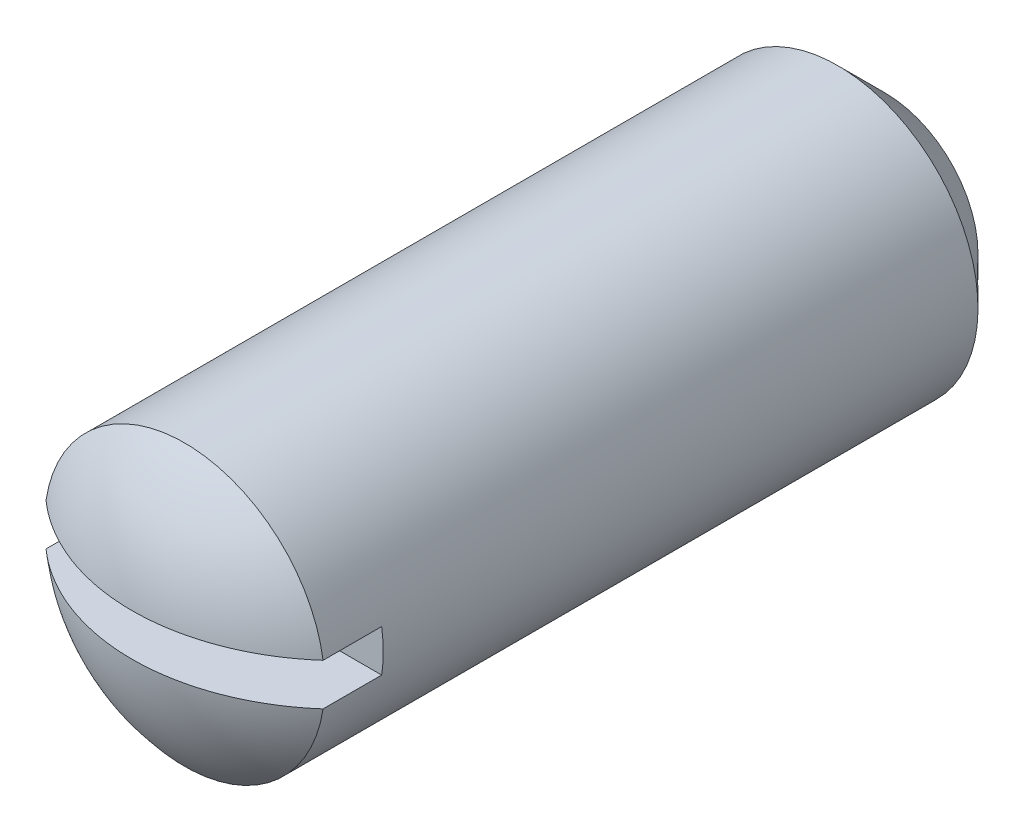
ISO-10303-21;
HEADER;
FILE_DESCRIPTION(('STEP AP214'),'2;1');
FILE_NAME('part.step','',(''),(''),'','','');
FILE_SCHEMA(('AUTOMOTIVE_DESIGN { 1 0 10303 214 1 1 1 1 }'));
ENDSEC;
DATA;
#1=APPLICATION_CONTEXT('core data for automotive mechanical design processes');
#2=APPLICATION_PROTOCOL_DEFINITION('international standard','automotive_design',2000,#1);
#3=PRODUCT_CONTEXT('',#1,'mechanical');
#4=PRODUCT('Part','Part','',(#3));
#5=PRODUCT_RELATED_PRODUCT_CATEGORY('part','',(#4));
#6=PRODUCT_DEFINITION_FORMATION('','',#4);
#7=PRODUCT_DEFINITION_CONTEXT('part definition',#1,'design');
#8=PRODUCT_DEFINITION('design','',#6,#7);
#9=PRODUCT_DEFINITION_SHAPE('','',#8);
#10=(LENGTH_UNIT() NAMED_UNIT(*) SI_UNIT(.MILLI.,.METRE.));
#11=(NAMED_UNIT(*) PLANE_ANGLE_UNIT() SI_UNIT($,.RADIAN.));
#12=(NAMED_UNIT(*) SI_UNIT($,.STERADIAN.) SOLID_ANGLE_UNIT());
#13=UNCERTAINTY_MEASURE_WITH_UNIT(LENGTH_MEASURE(1.E-05),#10,'distance_accuracy_value','');
#14=(GEOMETRIC_REPRESENTATION_CONTEXT(3) GLOBAL_UNCERTAINTY_ASSIGNED_CONTEXT((#13)) GLOBAL_UNIT_ASSIGNED_CONTEXT((#10,
#11,#12)) REPRESENTATION_CONTEXT('',''));
#15=CARTESIAN_POINT('',(0.,0.,0.));
#16=DIRECTION('',(0.,0.,1.));
#17=DIRECTION('',(1.,0.,0.));
#18=AXIS2_PLACEMENT_3D('',#15,#16,#17);
#19=CARTESIAN_POINT('',(0.,0.,-10.));
#20=DIRECTION('',(0.,0.,-1.));
#21=DIRECTION('',(0.,1.,0.));
#22=AXIS2_PLACEMENT_3D('',#19,#20,#21);
#23=CYLINDRICAL_SURFACE('',#22,4.);
#24=CARTESIAN_POINT('',(0.,0.,-8.65));
#25=DIRECTION('',(0.,0.,1.));
#26=DIRECTION('',(0.,-1.,0.));
#27=AXIS2_PLACEMENT_3D('',#24,#25,#26);
#28=CIRCLE('',#27,4.);
#29=CARTESIAN_POINT('',(0.,-4.,-8.65));
#30=VERTEX_POINT('',#29);
#31=EDGE_CURVE('E132',#30,#30,#28,.T.);
#32=ORIENTED_EDGE('',*,*,#31,.T.);
#33=EDGE_LOOP('',(#32));
#34=FACE_BOUND('',#33,.T.);
#35=DIRECTION('',(0.,0.,-1.));
#36=VECTOR('',#35,1.);
#37=CARTESIAN_POINT('',(3.95474398665704,-0.599999999999998,-10.));
#38=LINE('',#37,#36);
#39=CARTESIAN_POINT('',(3.95474398665704,-0.600000000000001,10.));
#40=VERTEX_POINT('',#39);
#41=CARTESIAN_POINT('',(3.95474398665704,-0.600000000000001,8.32786404500042));
#42=VERTEX_POINT('',#41);
#43=EDGE_CURVE('E143',#40,#42,#38,.T.);
#44=ORIENTED_EDGE('',*,*,#43,.F.);
#45=CARTESIAN_POINT('',(0.,0.,10.));
#46=DIRECTION('',(0.,0.,-1.));
#47=DIRECTION('',(0.,1.,0.));
#48=AXIS2_PLACEMENT_3D('',#45,#46,#47);
#49=CIRCLE('',#48,4.);
#50=CARTESIAN_POINT('',(-3.95474398665704,-0.600000000000001,10.));
#51=VERTEX_POINT('',#50);
#52=EDGE_CURVE('E140',#40,#51,#49,.T.);
#53=ORIENTED_EDGE('',*,*,#52,.T.);
#54=DIRECTION('',(0.,0.,-1.));
#55=VECTOR('',#54,1.);
#56=CARTESIAN_POINT('',(-3.95474398665704,-0.599999999999998,-10.));
#57=LINE('',#56,#55);
#58=CARTESIAN_POINT('',(-3.95474398665704,-0.600000000000001,8.32786404500042));
#59=VERTEX_POINT('',#58);
#60=EDGE_CURVE('E94',#59,#51,#57,.F.);
#61=ORIENTED_EDGE('',*,*,#60,.F.);
#62=CARTESIAN_POINT('',(0.,0.,8.32786404500042));
#63=DIRECTION('',(0.,0.,-1.));
#64=DIRECTION('',(-1.,0.,0.));
#65=AXIS2_PLACEMENT_3D('',#62,#63,#64);
#66=CIRCLE('',#65,4.);
#67=CARTESIAN_POINT('',(-3.95474398665704,0.6,8.32786404500042));
#68=VERTEX_POINT('',#67);
#69=EDGE_CURVE('E75',#59,#68,#66,.T.);
#70=ORIENTED_EDGE('',*,*,#69,.T.);
#71=DIRECTION('',(0.,0.,-1.));
#72=VECTOR('',#71,1.);
#73=CARTESIAN_POINT('',(-3.95474398665704,0.600000000000003,-10.));
#74=LINE('',#73,#72);
#75=CARTESIAN_POINT('',(-3.95474398665704,0.6,10.));
#76=VERTEX_POINT('',#75);
#77=EDGE_CURVE('E112',#68,#76,#74,.F.);
#78=ORIENTED_EDGE('',*,*,#77,.T.);
#79=CARTESIAN_POINT('',(3.95474398665704,0.6,10.));
#80=VERTEX_POINT('',#79);
#81=EDGE_CURVE('E141',#76,#80,#49,.T.);
#82=ORIENTED_EDGE('',*,*,#81,.T.);
#83=DIRECTION('',(0.,0.,-1.));
#84=VECTOR('',#83,1.);
#85=CARTESIAN_POINT('',(3.95474398665704,0.600000000000003,-10.));
#86=LINE('',#85,#84);
#87=CARTESIAN_POINT('',(3.95474398665704,0.6,8.32786404500042));
#88=VERTEX_POINT('',#87);
#89=EDGE_CURVE('E86',#80,#88,#86,.T.);
#90=ORIENTED_EDGE('',*,*,#89,.T.);
#91=EDGE_CURVE('E12',#88,#42,#66,.T.);
#92=ORIENTED_EDGE('',*,*,#91,.T.);
#93=EDGE_LOOP('',(#44,#53,#61,#70,#78,#82,#90,#92));
#94=FACE_BOUND('',#93,.T.);
#95=ADVANCED_FACE('F70',(#34,#94),#23,.T.);
#96=CARTESIAN_POINT('',(0.,0.,5.52786404500042));
#97=DIRECTION('',(0.,0.,-1.));
#98=DIRECTION('',(0.,1.,0.));
#99=AXIS2_PLACEMENT_3D('',#96,#97,#98);
#100=SPHERICAL_SURFACE('',#99,6.);
#101=ORIENTED_EDGE('',*,*,#52,.F.);
#102=CARTESIAN_POINT('',(0.,-0.6,5.52786404500042));
#103=DIRECTION('',(0.,1.,0.));
#104=DIRECTION('',(0.,0.,1.));
#105=AXIS2_PLACEMENT_3D('',#102,#103,#104);
#106=CIRCLE('',#105,5.96992462263972);
#107=EDGE_CURVE('E129',#40,#51,#106,.F.);
#108=ORIENTED_EDGE('',*,*,#107,.T.);
#109=EDGE_LOOP('',(#101,#108));
#110=FACE_BOUND('',#109,.T.);
#111=ADVANCED_FACE('F152',(#110),#100,.T.);
#112=CARTESIAN_POINT('',(0.,0.,-10.));
#113=DIRECTION('',(0.,0.,1.));
#114=DIRECTION('',(0.,-1.,0.));
#115=AXIS2_PLACEMENT_3D('',#112,#113,#114);
#116=PLANE('',#115);
#117=CARTESIAN_POINT('',(0.,0.,-10.));
#118=DIRECTION('',(0.,0.,1.));
#119=DIRECTION('',(0.,-1.,0.));
#120=AXIS2_PLACEMENT_3D('',#117,#118,#119);
#121=CIRCLE('',#120,2.65);
#122=CARTESIAN_POINT('',(0.,-2.65,-10.));
#123=VERTEX_POINT('',#122);
#124=EDGE_CURVE('E137',#123,#123,#121,.F.);
#125=ORIENTED_EDGE('',*,*,#124,.T.);
#126=EDGE_LOOP('',(#125));
#127=FACE_BOUND('',#126,.T.);
#128=ADVANCED_FACE('F150',(#127),#116,.F.);
#129=CARTESIAN_POINT('',(0.,0.600000000000001,5.52786404500042));
#130=DIRECTION('',(0.,1.,0.));
#131=DIRECTION('',(0.,0.,1.));
#132=AXIS2_PLACEMENT_3D('',#129,#130,#131);
#133=CIRCLE('',#132,5.96992462263972);
#134=EDGE_CURVE('E116',#80,#76,#133,.F.);
#135=ORIENTED_EDGE('',*,*,#134,.F.);
#136=ORIENTED_EDGE('',*,*,#81,.F.);
#137=EDGE_LOOP('',(#135,#136));
#138=FACE_BOUND('',#137,.T.);
#139=ADVANCED_FACE('F148',(#138),#100,.T.);
#140=CARTESIAN_POINT('',(0.,0.,-10.));
#141=DIRECTION('',(0.,0.,1.));
#142=DIRECTION('',(0.,-1.,0.));
#143=AXIS2_PLACEMENT_3D('',#140,#141,#142);
#144=CONICAL_SURFACE('',#143,2.65,0.785398163397448);
#145=ORIENTED_EDGE('',*,*,#31,.F.);
#146=EDGE_LOOP('',(#145));
#147=FACE_BOUND('',#146,.T.);
#148=ORIENTED_EDGE('',*,*,#124,.F.);
#149=EDGE_LOOP('',(#148));
#150=FACE_BOUND('',#149,.T.);
#151=ADVANCED_FACE('F73',(#147,#150),#144,.T.);
#152=CARTESIAN_POINT('',(-5.,-0.600000000000001,8.32786404500042));
#153=DIRECTION('',(0.,0.,-1.));
#154=DIRECTION('',(-1.,0.,0.));
#155=AXIS2_PLACEMENT_3D('',#152,#153,#154);
#156=PLANE('',#155);
#157=DIRECTION('',(1.,0.,0.));
#158=VECTOR('',#157,1.);
#159=CARTESIAN_POINT('',(-5.,0.6,8.32786404500042));
#160=LINE('',#159,#158);
#161=EDGE_CURVE('E115',#68,#88,#160,.T.);
#162=ORIENTED_EDGE('',*,*,#161,.F.);
#163=ORIENTED_EDGE('',*,*,#69,.F.);
#164=DIRECTION('',(1.,0.,0.));
#165=VECTOR('',#164,1.);
#166=CARTESIAN_POINT('',(-5.,-0.600000000000001,8.32786404500042));
#167=LINE('',#166,#165);
#168=EDGE_CURVE('E125',#59,#42,#167,.T.);
#169=ORIENTED_EDGE('',*,*,#168,.T.);
#170=ORIENTED_EDGE('',*,*,#91,.F.);
#171=EDGE_LOOP('',(#162,#163,#169,#170));
#172=FACE_BOUND('',#171,.T.);
#173=ADVANCED_FACE('F123',(#172),#156,.F.);
#174=CARTESIAN_POINT('',(-5.,-0.599999999999999,0.));
#175=DIRECTION('',(0.,1.,0.));
#176=DIRECTION('',(0.,0.,1.));
#177=AXIS2_PLACEMENT_3D('',#174,#175,#176);
#178=PLANE('',#177);
#179=ORIENTED_EDGE('',*,*,#43,.T.);
#180=ORIENTED_EDGE('',*,*,#168,.F.);
#181=ORIENTED_EDGE('',*,*,#60,.T.);
#182=ORIENTED_EDGE('',*,*,#107,.F.);
#183=EDGE_LOOP('',(#179,#180,#181,#182));
#184=FACE_BOUND('',#183,.T.);
#185=ADVANCED_FACE('F206',(#184),#178,.T.);
#186=CARTESIAN_POINT('',(-5.,0.600000000000001,0.));
#187=DIRECTION('',(0.,1.,0.));
#188=DIRECTION('',(0.,0.,1.));
#189=AXIS2_PLACEMENT_3D('',#186,#187,#188);
#190=PLANE('',#189);
#191=ORIENTED_EDGE('',*,*,#134,.T.);
#192=ORIENTED_EDGE('',*,*,#77,.F.);
#193=ORIENTED_EDGE('',*,*,#161,.T.);
#194=ORIENTED_EDGE('',*,*,#89,.F.);
#195=EDGE_LOOP('',(#191,#192,#193,#194));
#196=FACE_BOUND('',#195,.T.);
#197=ADVANCED_FACE('F114',(#196),#190,.F.);
#198=CLOSED_SHELL('',(#95,#111,#128,#139,#151,#173,#185,#197));
#199=MANIFOLD_SOLID_BREP('B2',#198);
#200=ADVANCED_BREP_SHAPE_REPRESENTATION('',(#18,#199),#14);
#201=SHAPE_DEFINITION_REPRESENTATION(#9,#200);
ENDSEC;
END-ISO-10303-21;
